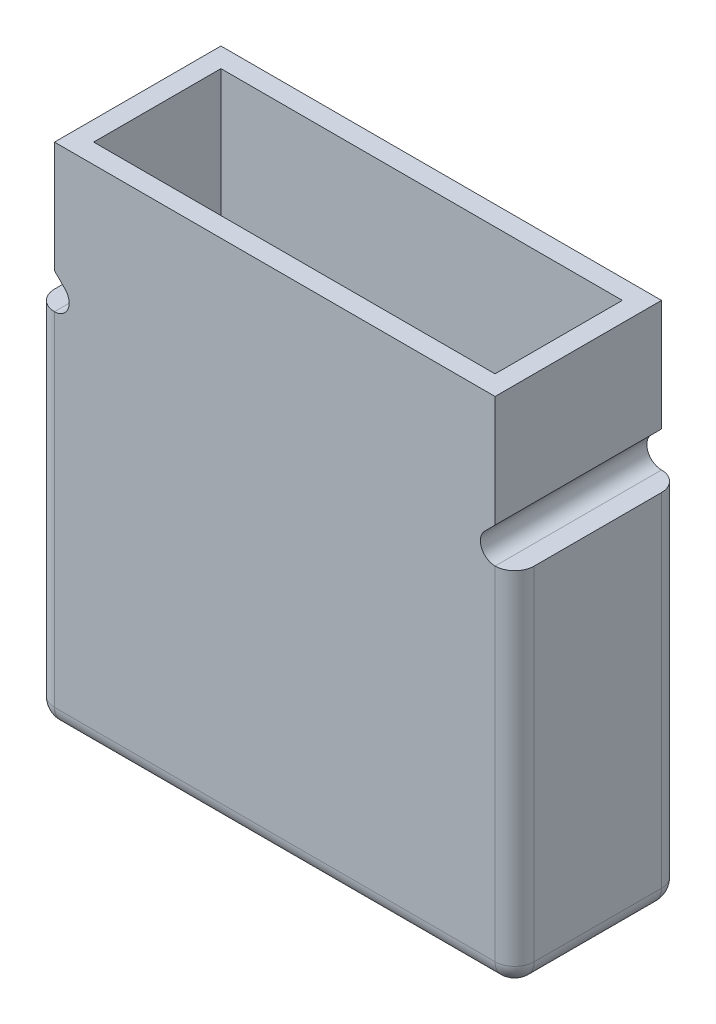
ISO-10303-21;
HEADER;
FILE_DESCRIPTION(('STEP AP214'),'2;1');
FILE_NAME('part.step','',(''),(''),'','','');
FILE_SCHEMA(('AUTOMOTIVE_DESIGN { 1 0 10303 214 1 1 1 1 }'));
ENDSEC;
DATA;
#1=APPLICATION_CONTEXT('core data for automotive mechanical design processes');
#2=APPLICATION_PROTOCOL_DEFINITION('international standard','automotive_design',2000,#1);
#3=PRODUCT_CONTEXT('',#1,'mechanical');
#4=PRODUCT('Part','Part','',(#3));
#5=PRODUCT_RELATED_PRODUCT_CATEGORY('part','',(#4));
#6=PRODUCT_DEFINITION_FORMATION('','',#4);
#7=PRODUCT_DEFINITION_CONTEXT('part definition',#1,'design');
#8=PRODUCT_DEFINITION('design','',#6,#7);
#9=PRODUCT_DEFINITION_SHAPE('','',#8);
#10=(LENGTH_UNIT() NAMED_UNIT(*) SI_UNIT(.MILLI.,.METRE.));
#11=(NAMED_UNIT(*) PLANE_ANGLE_UNIT() SI_UNIT($,.RADIAN.));
#12=(NAMED_UNIT(*) SI_UNIT($,.STERADIAN.) SOLID_ANGLE_UNIT());
#13=UNCERTAINTY_MEASURE_WITH_UNIT(LENGTH_MEASURE(1.E-05),#10,'distance_accuracy_value','');
#14=(GEOMETRIC_REPRESENTATION_CONTEXT(3) GLOBAL_UNCERTAINTY_ASSIGNED_CONTEXT((#13)) GLOBAL_UNIT_ASSIGNED_CONTEXT((#10,
#11,#12)) REPRESENTATION_CONTEXT('',''));
#15=CARTESIAN_POINT('',(0.,0.,0.));
#16=DIRECTION('',(0.,0.,1.));
#17=DIRECTION('',(1.,0.,0.));
#18=AXIS2_PLACEMENT_3D('',#15,#16,#17);
#19=CARTESIAN_POINT('',(-24.5,50.,8.5));
#20=DIRECTION('',(0.,1.,0.));
#21=DIRECTION('',(0.,0.,1.));
#22=AXIS2_PLACEMENT_3D('',#19,#20,#21);
#23=PLANE('',#22);
#24=DIRECTION('',(0.,0.,1.));
#25=VECTOR('',#24,1.);
#26=CARTESIAN_POINT('',(22.5,50.,-12.5));
#27=LINE('',#26,#25);
#28=CARTESIAN_POINT('',(22.5,50.,-8.5));
#29=VERTEX_POINT('',#28);
#30=CARTESIAN_POINT('',(22.5,50.,8.5));
#31=VERTEX_POINT('',#30);
#32=EDGE_CURVE('E674',#29,#31,#27,.T.);
#33=ORIENTED_EDGE('',*,*,#32,.F.);
#34=DIRECTION('',(-1.,0.,0.));
#35=VECTOR('',#34,1.);
#36=CARTESIAN_POINT('',(-24.5,50.,-8.5));
#37=LINE('',#36,#35);
#38=CARTESIAN_POINT('',(-22.5,50.,-8.5));
#39=VERTEX_POINT('',#38);
#40=EDGE_CURVE('E546',#29,#39,#37,.T.);
#41=ORIENTED_EDGE('',*,*,#40,.T.);
#42=DIRECTION('',(0.,0.,1.));
#43=VECTOR('',#42,1.);
#44=CARTESIAN_POINT('',(-22.5,50.,-12.5));
#45=LINE('',#44,#43);
#46=CARTESIAN_POINT('',(-22.5,50.,8.5));
#47=VERTEX_POINT('',#46);
#48=EDGE_CURVE('E522',#39,#47,#45,.T.);
#49=ORIENTED_EDGE('',*,*,#48,.T.);
#50=DIRECTION('',(1.,0.,0.));
#51=VECTOR('',#50,1.);
#52=CARTESIAN_POINT('',(-24.5,50.,8.5));
#53=LINE('',#52,#51);
#54=EDGE_CURVE('E543',#47,#31,#53,.T.);
#55=ORIENTED_EDGE('',*,*,#54,.T.);
#56=EDGE_LOOP('',(#33,#41,#49,#55));
#57=FACE_BOUND('',#56,.T.);
#58=DIRECTION('',(1.,0.,0.));
#59=VECTOR('',#58,1.);
#60=CARTESIAN_POINT('',(-20.5,50.,6.5));
#61=LINE('',#60,#59);
#62=CARTESIAN_POINT('',(-20.5,50.,6.5));
#63=VERTEX_POINT('',#62);
#64=CARTESIAN_POINT('',(20.5,50.,6.5));
#65=VERTEX_POINT('',#64);
#66=EDGE_CURVE('E529',#63,#65,#61,.T.);
#67=ORIENTED_EDGE('',*,*,#66,.F.);
#68=DIRECTION('',(0.,0.,1.));
#69=VECTOR('',#68,1.);
#70=CARTESIAN_POINT('',(-20.5,50.,-6.5));
#71=LINE('',#70,#69);
#72=CARTESIAN_POINT('',(-20.5,50.,-6.5));
#73=VERTEX_POINT('',#72);
#74=EDGE_CURVE('E527',#73,#63,#71,.T.);
#75=ORIENTED_EDGE('',*,*,#74,.F.);
#76=DIRECTION('',(-1.,0.,0.));
#77=VECTOR('',#76,1.);
#78=CARTESIAN_POINT('',(-20.5,50.,-6.5));
#79=LINE('',#78,#77);
#80=CARTESIAN_POINT('',(20.5,50.,-6.5));
#81=VERTEX_POINT('',#80);
#82=EDGE_CURVE('E508',#81,#73,#79,.T.);
#83=ORIENTED_EDGE('',*,*,#82,.F.);
#84=DIRECTION('',(0.,0.,-1.));
#85=VECTOR('',#84,1.);
#86=CARTESIAN_POINT('',(20.5,50.,-6.5));
#87=LINE('',#86,#85);
#88=EDGE_CURVE('E535',#65,#81,#87,.T.);
#89=ORIENTED_EDGE('',*,*,#88,.F.);
#90=EDGE_LOOP('',(#67,#75,#83,#89));
#91=FACE_BOUND('',#90,.T.);
#92=ADVANCED_FACE('F366',(#57,#91),#23,.T.);
#93=CARTESIAN_POINT('',(-24.5,50.,-8.5));
#94=DIRECTION('',(1.,0.,0.));
#95=DIRECTION('',(0.,0.,-1.));
#96=AXIS2_PLACEMENT_3D('',#93,#94,#95);
#97=PLANE('',#96);
#98=DIRECTION('',(0.,0.,1.));
#99=VECTOR('',#98,1.);
#100=CARTESIAN_POINT('',(-24.5,35.,-12.5));
#101=LINE('',#100,#99);
#102=CARTESIAN_POINT('',(-24.5,35.,-6.5));
#103=VERTEX_POINT('',#102);
#104=CARTESIAN_POINT('',(-24.5,35.,6.5));
#105=VERTEX_POINT('',#104);
#106=EDGE_CURVE('E694',#103,#105,#101,.T.);
#107=ORIENTED_EDGE('',*,*,#106,.F.);
#108=DIRECTION('',(0.,-1.,0.));
#109=VECTOR('',#108,1.);
#110=CARTESIAN_POINT('',(-24.5,50.,-6.5));
#111=LINE('',#110,#109);
#112=CARTESIAN_POINT('',(-24.5,0.,-6.5));
#113=VERTEX_POINT('',#112);
#114=EDGE_CURVE('E587',#103,#113,#111,.T.);
#115=ORIENTED_EDGE('',*,*,#114,.T.);
#116=DIRECTION('',(0.,0.,-1.));
#117=VECTOR('',#116,1.);
#118=CARTESIAN_POINT('',(-24.5,0.,8.5));
#119=LINE('',#118,#117);
#120=CARTESIAN_POINT('',(-24.5,0.,6.5));
#121=VERTEX_POINT('',#120);
#122=EDGE_CURVE('E585',#113,#121,#119,.F.);
#123=ORIENTED_EDGE('',*,*,#122,.T.);
#124=DIRECTION('',(0.,-1.,0.));
#125=VECTOR('',#124,1.);
#126=CARTESIAN_POINT('',(-24.5,50.,6.5));
#127=LINE('',#126,#125);
#128=EDGE_CURVE('E583',#121,#105,#127,.F.);
#129=ORIENTED_EDGE('',*,*,#128,.T.);
#130=EDGE_LOOP('',(#107,#115,#123,#129));
#131=FACE_BOUND('',#130,.T.);
#132=ADVANCED_FACE('F368',(#131),#97,.F.);
#133=CARTESIAN_POINT('',(-24.5,50.,8.5));
#134=DIRECTION('',(0.,0.,-1.));
#135=DIRECTION('',(-1.,0.,0.));
#136=AXIS2_PLACEMENT_3D('',#133,#134,#135);
#137=PLANE('',#136);
#138=DIRECTION('',(-1.,0.,0.));
#139=VECTOR('',#138,1.);
#140=CARTESIAN_POINT('',(24.5,0.,8.5));
#141=LINE('',#140,#139);
#142=CARTESIAN_POINT('',(-22.5,0.,8.5));
#143=VERTEX_POINT('',#142);
#144=CARTESIAN_POINT('',(22.5,0.,8.5));
#145=VERTEX_POINT('',#144);
#146=EDGE_CURVE('E595',#143,#145,#141,.F.);
#147=ORIENTED_EDGE('',*,*,#146,.T.);
#148=DIRECTION('',(0.,-1.,0.));
#149=VECTOR('',#148,1.);
#150=CARTESIAN_POINT('',(22.5,50.,8.5));
#151=LINE('',#150,#149);
#152=CARTESIAN_POINT('',(22.5,35.,8.5));
#153=VERTEX_POINT('',#152);
#154=EDGE_CURVE('E597',#145,#153,#151,.F.);
#155=ORIENTED_EDGE('',*,*,#154,.T.);
#156=CARTESIAN_POINT('',(22.5,36.5,8.5));
#157=DIRECTION('',(0.,0.,1.));
#158=DIRECTION('',(-1.,0.,0.));
#159=AXIS2_PLACEMENT_3D('',#156,#157,#158);
#160=CIRCLE('',#159,1.49999999999999);
#161=CARTESIAN_POINT('',(21.4393398282202,37.5606601717798,8.5));
#162=VERTEX_POINT('',#161);
#163=EDGE_CURVE('E671',#162,#153,#160,.T.);
#164=ORIENTED_EDGE('',*,*,#163,.F.);
#165=DIRECTION('',(-0.70710678118654,-0.707106781186554,0.));
#166=VECTOR('',#165,1.);
#167=CARTESIAN_POINT('',(21.4393398282202,37.5606601717798,8.5));
#168=LINE('',#167,#166);
#169=CARTESIAN_POINT('',(22.5,38.6213203435597,8.5));
#170=VERTEX_POINT('',#169);
#171=EDGE_CURVE('E668',#170,#162,#168,.T.);
#172=ORIENTED_EDGE('',*,*,#171,.F.);
#173=DIRECTION('',(0.,-1.,0.));
#174=VECTOR('',#173,1.);
#175=CARTESIAN_POINT('',(22.5,50.,8.5));
#176=LINE('',#175,#174);
#177=EDGE_CURVE('E665',#31,#170,#176,.T.);
#178=ORIENTED_EDGE('',*,*,#177,.F.);
#179=ORIENTED_EDGE('',*,*,#54,.F.);
#180=DIRECTION('',(0.,1.,0.));
#181=VECTOR('',#180,1.);
#182=CARTESIAN_POINT('',(-22.5,38.6213203435597,8.5));
#183=LINE('',#182,#181);
#184=CARTESIAN_POINT('',(-22.5,38.6213203435597,8.5));
#185=VERTEX_POINT('',#184);
#186=EDGE_CURVE('E692',#185,#47,#183,.T.);
#187=ORIENTED_EDGE('',*,*,#186,.F.);
#188=DIRECTION('',(-0.707106781186547,0.707106781186547,0.));
#189=VECTOR('',#188,1.);
#190=CARTESIAN_POINT('',(-21.4393398282202,37.5606601717798,8.5));
#191=LINE('',#190,#189);
#192=CARTESIAN_POINT('',(-21.4393398282202,37.5606601717798,8.5));
#193=VERTEX_POINT('',#192);
#194=EDGE_CURVE('E689',#193,#185,#191,.T.);
#195=ORIENTED_EDGE('',*,*,#194,.F.);
#196=CARTESIAN_POINT('',(-22.5,36.5,8.5));
#197=DIRECTION('',(0.,0.,1.));
#198=DIRECTION('',(1.,0.,0.));
#199=AXIS2_PLACEMENT_3D('',#196,#197,#198);
#200=CIRCLE('',#199,1.5);
#201=CARTESIAN_POINT('',(-22.5,35.,8.5));
#202=VERTEX_POINT('',#201);
#203=EDGE_CURVE('E678',#202,#193,#200,.T.);
#204=ORIENTED_EDGE('',*,*,#203,.F.);
#205=DIRECTION('',(0.,-1.,0.));
#206=VECTOR('',#205,1.);
#207=CARTESIAN_POINT('',(-22.5,50.,8.5));
#208=LINE('',#207,#206);
#209=EDGE_CURVE('E593',#202,#143,#208,.T.);
#210=ORIENTED_EDGE('',*,*,#209,.T.);
#211=EDGE_LOOP('',(#147,#155,#164,#172,#178,#179,#187,#195,#204,#210));
#212=FACE_BOUND('',#211,.T.);
#213=ADVANCED_FACE('F720',(#212),#137,.F.);
#214=CARTESIAN_POINT('',(24.5,50.,-8.5));
#215=DIRECTION('',(-1.,0.,0.));
#216=DIRECTION('',(0.,0.,1.));
#217=AXIS2_PLACEMENT_3D('',#214,#215,#216);
#218=PLANE('',#217);
#219=DIRECTION('',(0.,0.,1.));
#220=VECTOR('',#219,1.);
#221=CARTESIAN_POINT('',(24.5,0.,-8.5));
#222=LINE('',#221,#220);
#223=CARTESIAN_POINT('',(24.5,0.,6.5));
#224=VERTEX_POINT('',#223);
#225=CARTESIAN_POINT('',(24.5,0.,-6.5));
#226=VERTEX_POINT('',#225);
#227=EDGE_CURVE('E573',#224,#226,#222,.F.);
#228=ORIENTED_EDGE('',*,*,#227,.T.);
#229=DIRECTION('',(0.,-1.,0.));
#230=VECTOR('',#229,1.);
#231=CARTESIAN_POINT('',(24.5,50.,-6.5));
#232=LINE('',#231,#230);
#233=CARTESIAN_POINT('',(24.5,35.,-6.5));
#234=VERTEX_POINT('',#233);
#235=EDGE_CURVE('E577',#226,#234,#232,.F.);
#236=ORIENTED_EDGE('',*,*,#235,.T.);
#237=DIRECTION('',(0.,0.,1.));
#238=VECTOR('',#237,1.);
#239=CARTESIAN_POINT('',(24.5,35.,-12.5));
#240=LINE('',#239,#238);
#241=CARTESIAN_POINT('',(24.5,35.,6.5));
#242=VERTEX_POINT('',#241);
#243=EDGE_CURVE('E675',#234,#242,#240,.T.);
#244=ORIENTED_EDGE('',*,*,#243,.T.);
#245=DIRECTION('',(0.,-1.,0.));
#246=VECTOR('',#245,1.);
#247=CARTESIAN_POINT('',(24.5,50.,6.5));
#248=LINE('',#247,#246);
#249=EDGE_CURVE('E575',#242,#224,#248,.T.);
#250=ORIENTED_EDGE('',*,*,#249,.T.);
#251=EDGE_LOOP('',(#228,#236,#244,#250));
#252=FACE_BOUND('',#251,.T.);
#253=ADVANCED_FACE('F729',(#252),#218,.F.);
#254=CARTESIAN_POINT('',(-24.5,50.,-8.5));
#255=DIRECTION('',(0.,0.,1.));
#256=DIRECTION('',(1.,0.,0.));
#257=AXIS2_PLACEMENT_3D('',#254,#255,#256);
#258=PLANE('',#257);
#259=CARTESIAN_POINT('',(22.5,36.5,-8.5));
#260=DIRECTION('',(0.,0.,1.));
#261=DIRECTION('',(1.,0.,0.));
#262=AXIS2_PLACEMENT_3D('',#259,#260,#261);
#263=CIRCLE('',#262,1.49999999999999);
#264=CARTESIAN_POINT('',(21.4393398282202,37.5606601717798,-8.5));
#265=VERTEX_POINT('',#264);
#266=CARTESIAN_POINT('',(22.5,35.,-8.5));
#267=VERTEX_POINT('',#266);
#268=EDGE_CURVE('E563',#265,#267,#263,.T.);
#269=ORIENTED_EDGE('',*,*,#268,.T.);
#270=DIRECTION('',(0.,-1.,0.));
#271=VECTOR('',#270,1.);
#272=CARTESIAN_POINT('',(22.5,50.,-8.5));
#273=LINE('',#272,#271);
#274=CARTESIAN_POINT('',(22.5,0.,-8.5));
#275=VERTEX_POINT('',#274);
#276=EDGE_CURVE('E570',#267,#275,#273,.T.);
#277=ORIENTED_EDGE('',*,*,#276,.T.);
#278=DIRECTION('',(1.,0.,0.));
#279=VECTOR('',#278,1.);
#280=CARTESIAN_POINT('',(-24.5,0.,-8.5));
#281=LINE('',#280,#279);
#282=CARTESIAN_POINT('',(-22.5,0.,-8.5));
#283=VERTEX_POINT('',#282);
#284=EDGE_CURVE('E566',#275,#283,#281,.F.);
#285=ORIENTED_EDGE('',*,*,#284,.T.);
#286=DIRECTION('',(0.,-1.,0.));
#287=VECTOR('',#286,1.);
#288=CARTESIAN_POINT('',(-22.5,50.,-8.5));
#289=LINE('',#288,#287);
#290=CARTESIAN_POINT('',(-22.5,35.,-8.5));
#291=VERTEX_POINT('',#290);
#292=EDGE_CURVE('E568',#283,#291,#289,.F.);
#293=ORIENTED_EDGE('',*,*,#292,.T.);
#294=CARTESIAN_POINT('',(-22.5,36.5,-8.5));
#295=DIRECTION('',(0.,0.,1.));
#296=DIRECTION('',(1.,0.,0.));
#297=AXIS2_PLACEMENT_3D('',#294,#295,#296);
#298=CIRCLE('',#297,1.5);
#299=CARTESIAN_POINT('',(-21.4393398282202,37.5606601717798,-8.5));
#300=VERTEX_POINT('',#299);
#301=EDGE_CURVE('E548',#291,#300,#298,.T.);
#302=ORIENTED_EDGE('',*,*,#301,.T.);
#303=DIRECTION('',(-0.707106781186548,0.707106781186548,0.));
#304=VECTOR('',#303,1.);
#305=CARTESIAN_POINT('',(-29.1893398282202,45.3106601717798,-8.5));
#306=LINE('',#305,#304);
#307=CARTESIAN_POINT('',(-22.5,38.6213203435597,-8.5));
#308=VERTEX_POINT('',#307);
#309=EDGE_CURVE('E551',#300,#308,#306,.T.);
#310=ORIENTED_EDGE('',*,*,#309,.T.);
#311=DIRECTION('',(0.,1.,0.));
#312=VECTOR('',#311,1.);
#313=CARTESIAN_POINT('',(-22.5,50.,-8.5));
#314=LINE('',#313,#312);
#315=EDGE_CURVE('E554',#308,#39,#314,.T.);
#316=ORIENTED_EDGE('',*,*,#315,.T.);
#317=ORIENTED_EDGE('',*,*,#40,.F.);
#318=DIRECTION('',(0.,-1.,0.));
#319=VECTOR('',#318,1.);
#320=CARTESIAN_POINT('',(22.5,50.,-8.5));
#321=LINE('',#320,#319);
#322=CARTESIAN_POINT('',(22.5,38.6213203435597,-8.5));
#323=VERTEX_POINT('',#322);
#324=EDGE_CURVE('E557',#29,#323,#321,.T.);
#325=ORIENTED_EDGE('',*,*,#324,.T.);
#326=DIRECTION('',(-0.707106781186541,-0.707106781186554,0.));
#327=VECTOR('',#326,1.);
#328=CARTESIAN_POINT('',(4.68933982822064,20.8106601717799,-8.5));
#329=LINE('',#328,#327);
#330=EDGE_CURVE('E560',#323,#265,#329,.T.);
#331=ORIENTED_EDGE('',*,*,#330,.T.);
#332=EDGE_LOOP('',(#269,#277,#285,#293,#302,#310,#316,#317,#325,#331));
#333=FACE_BOUND('',#332,.T.);
#334=ADVANCED_FACE('F726',(#333),#258,.F.);
#335=CARTESIAN_POINT('',(-20.5,50.,-6.5));
#336=DIRECTION('',(1.,0.,0.));
#337=DIRECTION('',(0.,0.,-1.));
#338=AXIS2_PLACEMENT_3D('',#335,#336,#337);
#339=PLANE('',#338);
#340=DIRECTION('',(0.,0.,1.));
#341=VECTOR('',#340,1.);
#342=CARTESIAN_POINT('',(-20.5,0.,-6.5));
#343=LINE('',#342,#341);
#344=CARTESIAN_POINT('',(-20.5,0.,-6.5));
#345=VERTEX_POINT('',#344);
#346=CARTESIAN_POINT('',(-20.5,0.,6.5));
#347=VERTEX_POINT('',#346);
#348=EDGE_CURVE('E515',#345,#347,#343,.T.);
#349=ORIENTED_EDGE('',*,*,#348,.F.);
#350=DIRECTION('',(0.,-1.,0.));
#351=VECTOR('',#350,1.);
#352=CARTESIAN_POINT('',(-20.5,50.,-6.5));
#353=LINE('',#352,#351);
#354=EDGE_CURVE('E501',#73,#345,#353,.T.);
#355=ORIENTED_EDGE('',*,*,#354,.F.);
#356=ORIENTED_EDGE('',*,*,#74,.T.);
#357=DIRECTION('',(0.,-1.,0.));
#358=VECTOR('',#357,1.);
#359=CARTESIAN_POINT('',(-20.5,50.,6.5));
#360=LINE('',#359,#358);
#361=EDGE_CURVE('E518',#63,#347,#360,.T.);
#362=ORIENTED_EDGE('',*,*,#361,.T.);
#363=EDGE_LOOP('',(#349,#355,#356,#362));
#364=FACE_BOUND('',#363,.T.);
#365=ADVANCED_FACE('F516',(#364),#339,.T.);
#366=CARTESIAN_POINT('',(-20.5,50.,6.5));
#367=DIRECTION('',(0.,0.,-1.));
#368=DIRECTION('',(-1.,0.,0.));
#369=AXIS2_PLACEMENT_3D('',#366,#367,#368);
#370=PLANE('',#369);
#371=DIRECTION('',(1.,0.,0.));
#372=VECTOR('',#371,1.);
#373=CARTESIAN_POINT('',(-20.5,0.,6.5));
#374=LINE('',#373,#372);
#375=CARTESIAN_POINT('',(20.5,0.,6.5));
#376=VERTEX_POINT('',#375);
#377=EDGE_CURVE('E521',#347,#376,#374,.T.);
#378=ORIENTED_EDGE('',*,*,#377,.F.);
#379=ORIENTED_EDGE('',*,*,#361,.F.);
#380=ORIENTED_EDGE('',*,*,#66,.T.);
#381=DIRECTION('',(0.,-1.,0.));
#382=VECTOR('',#381,1.);
#383=CARTESIAN_POINT('',(20.5,50.,6.5));
#384=LINE('',#383,#382);
#385=EDGE_CURVE('E540',#65,#376,#384,.T.);
#386=ORIENTED_EDGE('',*,*,#385,.T.);
#387=EDGE_LOOP('',(#378,#379,#380,#386));
#388=FACE_BOUND('',#387,.T.);
#389=ADVANCED_FACE('F706',(#388),#370,.T.);
#390=CARTESIAN_POINT('',(20.5,50.,-6.5));
#391=DIRECTION('',(-1.,0.,0.));
#392=DIRECTION('',(0.,0.,1.));
#393=AXIS2_PLACEMENT_3D('',#390,#391,#392);
#394=PLANE('',#393);
#395=DIRECTION('',(0.,0.,-1.));
#396=VECTOR('',#395,1.);
#397=CARTESIAN_POINT('',(20.5,0.,-6.5));
#398=LINE('',#397,#396);
#399=CARTESIAN_POINT('',(20.5,0.,-6.5));
#400=VERTEX_POINT('',#399);
#401=EDGE_CURVE('E526',#376,#400,#398,.T.);
#402=ORIENTED_EDGE('',*,*,#401,.F.);
#403=ORIENTED_EDGE('',*,*,#385,.F.);
#404=ORIENTED_EDGE('',*,*,#88,.T.);
#405=DIRECTION('',(0.,-1.,0.));
#406=VECTOR('',#405,1.);
#407=CARTESIAN_POINT('',(20.5,50.,-6.5));
#408=LINE('',#407,#406);
#409=EDGE_CURVE('E511',#81,#400,#408,.T.);
#410=ORIENTED_EDGE('',*,*,#409,.T.);
#411=EDGE_LOOP('',(#402,#403,#404,#410));
#412=FACE_BOUND('',#411,.T.);
#413=ADVANCED_FACE('F711',(#412),#394,.T.);
#414=CARTESIAN_POINT('',(-20.5,50.,-6.5));
#415=DIRECTION('',(0.,0.,1.));
#416=DIRECTION('',(1.,0.,0.));
#417=AXIS2_PLACEMENT_3D('',#414,#415,#416);
#418=PLANE('',#417);
#419=DIRECTION('',(-1.,0.,0.));
#420=VECTOR('',#419,1.);
#421=CARTESIAN_POINT('',(-20.5,0.,-6.5));
#422=LINE('',#421,#420);
#423=EDGE_CURVE('E505',#400,#345,#422,.T.);
#424=ORIENTED_EDGE('',*,*,#423,.F.);
#425=ORIENTED_EDGE('',*,*,#409,.F.);
#426=ORIENTED_EDGE('',*,*,#82,.T.);
#427=ORIENTED_EDGE('',*,*,#354,.T.);
#428=EDGE_LOOP('',(#424,#425,#426,#427));
#429=FACE_BOUND('',#428,.T.);
#430=ADVANCED_FACE('F503',(#429),#418,.T.);
#431=CARTESIAN_POINT('',(-22.5,38.6213203435597,-12.5));
#432=DIRECTION('',(1.,0.,0.));
#433=DIRECTION('',(0.,0.,-1.));
#434=AXIS2_PLACEMENT_3D('',#431,#432,#433);
#435=PLANE('',#434);
#436=DIRECTION('',(0.,0.,1.));
#437=VECTOR('',#436,1.);
#438=CARTESIAN_POINT('',(-22.5,38.6213203435597,-12.5));
#439=LINE('',#438,#437);
#440=EDGE_CURVE('E697',#308,#185,#439,.T.);
#441=ORIENTED_EDGE('',*,*,#440,.T.);
#442=ORIENTED_EDGE('',*,*,#186,.T.);
#443=ORIENTED_EDGE('',*,*,#48,.F.);
#444=ORIENTED_EDGE('',*,*,#315,.F.);
#445=EDGE_LOOP('',(#441,#442,#443,#444));
#446=FACE_BOUND('',#445,.T.);
#447=ADVANCED_FACE('F773',(#446),#435,.F.);
#448=CARTESIAN_POINT('',(-21.4393398282202,37.5606601717798,-12.5));
#449=DIRECTION('',(0.707106781186547,0.707106781186547,0.));
#450=DIRECTION('',(-0.707106781186548,0.707106781186548,0.));
#451=AXIS2_PLACEMENT_3D('',#448,#449,#450);
#452=PLANE('',#451);
#453=DIRECTION('',(0.,0.,1.));
#454=VECTOR('',#453,1.);
#455=CARTESIAN_POINT('',(-21.4393398282202,37.5606601717798,-12.5));
#456=LINE('',#455,#454);
#457=EDGE_CURVE('E699',#300,#193,#456,.T.);
#458=ORIENTED_EDGE('',*,*,#457,.T.);
#459=ORIENTED_EDGE('',*,*,#194,.T.);
#460=ORIENTED_EDGE('',*,*,#440,.F.);
#461=ORIENTED_EDGE('',*,*,#309,.F.);
#462=EDGE_LOOP('',(#458,#459,#460,#461));
#463=FACE_BOUND('',#462,.T.);
#464=ADVANCED_FACE('F778',(#463),#452,.F.);
#465=CARTESIAN_POINT('',(-22.5,36.5,-12.5));
#466=DIRECTION('',(0.,0.,1.));
#467=DIRECTION('',(1.,0.,0.));
#468=AXIS2_PLACEMENT_3D('',#465,#466,#467);
#469=CYLINDRICAL_SURFACE('',#468,1.5);
#470=DIRECTION('',(0.,0.,1.));
#471=VECTOR('',#470,1.);
#472=CARTESIAN_POINT('',(-22.5,35.,-12.5));
#473=LINE('',#472,#471);
#474=EDGE_CURVE('E701',#291,#202,#473,.T.);
#475=ORIENTED_EDGE('',*,*,#474,.T.);
#476=ORIENTED_EDGE('',*,*,#203,.T.);
#477=ORIENTED_EDGE('',*,*,#457,.F.);
#478=ORIENTED_EDGE('',*,*,#301,.F.);
#479=EDGE_LOOP('',(#475,#476,#477,#478));
#480=FACE_BOUND('',#479,.T.);
#481=ADVANCED_FACE('F780',(#480),#469,.F.);
#482=CARTESIAN_POINT('',(-24.5,35.,-12.5));
#483=DIRECTION('',(0.,-1.,0.));
#484=DIRECTION('',(1.,0.,0.));
#485=AXIS2_PLACEMENT_3D('',#482,#483,#484);
#486=PLANE('',#485);
#487=ORIENTED_EDGE('',*,*,#474,.F.);
#488=CARTESIAN_POINT('',(-22.5,35.,-6.5));
#489=DIRECTION('',(0.,-1.,0.));
#490=DIRECTION('',(1.,0.,0.));
#491=AXIS2_PLACEMENT_3D('',#488,#489,#490);
#492=CIRCLE('',#491,2.);
#493=EDGE_CURVE('E591',#291,#103,#492,.F.);
#494=ORIENTED_EDGE('',*,*,#493,.T.);
#495=ORIENTED_EDGE('',*,*,#106,.T.);
#496=CARTESIAN_POINT('',(-22.5,35.,6.5));
#497=DIRECTION('',(0.,-1.,0.));
#498=DIRECTION('',(1.,0.,0.));
#499=AXIS2_PLACEMENT_3D('',#496,#497,#498);
#500=CIRCLE('',#499,2.);
#501=EDGE_CURVE('E589',#105,#202,#500,.F.);
#502=ORIENTED_EDGE('',*,*,#501,.T.);
#503=EDGE_LOOP('',(#487,#494,#495,#502));
#504=FACE_BOUND('',#503,.T.);
#505=ADVANCED_FACE('F791',(#504),#486,.F.);
#506=CARTESIAN_POINT('',(24.5,35.,-12.5));
#507=DIRECTION('',(0.,-1.,0.));
#508=DIRECTION('',(1.,0.,0.));
#509=AXIS2_PLACEMENT_3D('',#506,#507,#508);
#510=PLANE('',#509);
#511=ORIENTED_EDGE('',*,*,#243,.F.);
#512=CARTESIAN_POINT('',(22.5,35.,-6.5));
#513=DIRECTION('',(0.,-1.,0.));
#514=DIRECTION('',(1.,0.,0.));
#515=AXIS2_PLACEMENT_3D('',#512,#513,#514);
#516=CIRCLE('',#515,2.);
#517=EDGE_CURVE('E581',#234,#267,#516,.F.);
#518=ORIENTED_EDGE('',*,*,#517,.T.);
#519=DIRECTION('',(0.,0.,1.));
#520=VECTOR('',#519,1.);
#521=CARTESIAN_POINT('',(22.5,35.,-12.5));
#522=LINE('',#521,#520);
#523=EDGE_CURVE('E679',#267,#153,#522,.T.);
#524=ORIENTED_EDGE('',*,*,#523,.T.);
#525=CARTESIAN_POINT('',(22.5,35.,6.5));
#526=DIRECTION('',(0.,-1.,0.));
#527=DIRECTION('',(1.,0.,0.));
#528=AXIS2_PLACEMENT_3D('',#525,#526,#527);
#529=CIRCLE('',#528,2.);
#530=EDGE_CURVE('E579',#153,#242,#529,.F.);
#531=ORIENTED_EDGE('',*,*,#530,.T.);
#532=EDGE_LOOP('',(#511,#518,#524,#531));
#533=FACE_BOUND('',#532,.T.);
#534=ADVANCED_FACE('F753',(#533),#510,.F.);
#535=CARTESIAN_POINT('',(22.5,36.5,-12.5));
#536=DIRECTION('',(0.,0.,1.));
#537=DIRECTION('',(1.,0.,0.));
#538=AXIS2_PLACEMENT_3D('',#535,#536,#537);
#539=CYLINDRICAL_SURFACE('',#538,1.49999999999999);
#540=DIRECTION('',(0.,0.,1.));
#541=VECTOR('',#540,1.);
#542=CARTESIAN_POINT('',(21.4393398282202,37.5606601717798,-12.5));
#543=LINE('',#542,#541);
#544=EDGE_CURVE('E682',#265,#162,#543,.T.);
#545=ORIENTED_EDGE('',*,*,#544,.T.);
#546=ORIENTED_EDGE('',*,*,#163,.T.);
#547=ORIENTED_EDGE('',*,*,#523,.F.);
#548=ORIENTED_EDGE('',*,*,#268,.F.);
#549=EDGE_LOOP('',(#545,#546,#547,#548));
#550=FACE_BOUND('',#549,.T.);
#551=ADVANCED_FACE('F762',(#550),#539,.F.);
#552=CARTESIAN_POINT('',(21.4393398282202,37.5606601717798,-12.5));
#553=DIRECTION('',(-0.707106781186554,0.707106781186541,0.));
#554=DIRECTION('',(-0.707106781186541,-0.707106781186554,0.));
#555=AXIS2_PLACEMENT_3D('',#552,#553,#554);
#556=PLANE('',#555);
#557=DIRECTION('',(0.,0.,1.));
#558=VECTOR('',#557,1.);
#559=CARTESIAN_POINT('',(22.5,38.6213203435597,-12.5));
#560=LINE('',#559,#558);
#561=EDGE_CURVE('E684',#323,#170,#560,.T.);
#562=ORIENTED_EDGE('',*,*,#561,.T.);
#563=ORIENTED_EDGE('',*,*,#171,.T.);
#564=ORIENTED_EDGE('',*,*,#544,.F.);
#565=ORIENTED_EDGE('',*,*,#330,.F.);
#566=EDGE_LOOP('',(#562,#563,#564,#565));
#567=FACE_BOUND('',#566,.T.);
#568=ADVANCED_FACE('F764',(#567),#556,.F.);
#569=CARTESIAN_POINT('',(22.5,50.,-12.5));
#570=DIRECTION('',(-1.,0.,0.));
#571=DIRECTION('',(0.,0.,1.));
#572=AXIS2_PLACEMENT_3D('',#569,#570,#571);
#573=PLANE('',#572);
#574=ORIENTED_EDGE('',*,*,#32,.T.);
#575=ORIENTED_EDGE('',*,*,#177,.T.);
#576=ORIENTED_EDGE('',*,*,#561,.F.);
#577=ORIENTED_EDGE('',*,*,#324,.F.);
#578=EDGE_LOOP('',(#574,#575,#576,#577));
#579=FACE_BOUND('',#578,.T.);
#580=ADVANCED_FACE('F808',(#579),#573,.F.);
#581=CARTESIAN_POINT('',(-24.5,0.,-8.5));
#582=DIRECTION('',(0.,-1.,0.));
#583=DIRECTION('',(0.,0.,-1.));
#584=AXIS2_PLACEMENT_3D('',#581,#582,#583);
#585=PLANE('',#584);
#586=ORIENTED_EDGE('',*,*,#348,.T.);
#587=ORIENTED_EDGE('',*,*,#377,.T.);
#588=ORIENTED_EDGE('',*,*,#401,.T.);
#589=ORIENTED_EDGE('',*,*,#423,.T.);
#590=EDGE_LOOP('',(#586,#587,#588,#589));
#591=FACE_BOUND('',#590,.T.);
#592=ADVANCED_FACE('F524',(#591),#585,.F.);
#593=CARTESIAN_POINT('',(-24.5,-2.,-8.5));
#594=DIRECTION('',(0.,-1.,0.));
#595=DIRECTION('',(0.,0.,-1.));
#596=AXIS2_PLACEMENT_3D('',#593,#594,#595);
#597=PLANE('',#596);
#598=DIRECTION('',(1.,0.,0.));
#599=VECTOR('',#598,1.);
#600=CARTESIAN_POINT('',(24.5,-2.,-6.5));
#601=LINE('',#600,#599);
#602=CARTESIAN_POINT('',(-22.5,-2.,-6.5));
#603=VERTEX_POINT('',#602);
#604=CARTESIAN_POINT('',(22.5,-2.,-6.5));
#605=VERTEX_POINT('',#604);
#606=EDGE_CURVE('E374',#603,#605,#601,.T.);
#607=ORIENTED_EDGE('',*,*,#606,.T.);
#608=DIRECTION('',(0.,0.,1.));
#609=VECTOR('',#608,1.);
#610=CARTESIAN_POINT('',(22.5,-2.,8.5));
#611=LINE('',#610,#609);
#612=CARTESIAN_POINT('',(22.5,-2.,6.5));
#613=VERTEX_POINT('',#612);
#614=EDGE_CURVE('E11',#605,#613,#611,.T.);
#615=ORIENTED_EDGE('',*,*,#614,.T.);
#616=DIRECTION('',(-1.,0.,0.));
#617=VECTOR('',#616,1.);
#618=CARTESIAN_POINT('',(-24.5,-2.,6.5));
#619=LINE('',#618,#617);
#620=CARTESIAN_POINT('',(-22.5,-2.,6.5));
#621=VERTEX_POINT('',#620);
#622=EDGE_CURVE('E599',#613,#621,#619,.T.);
#623=ORIENTED_EDGE('',*,*,#622,.T.);
#624=DIRECTION('',(0.,0.,-1.));
#625=VECTOR('',#624,1.);
#626=CARTESIAN_POINT('',(-22.5,-2.,-8.5));
#627=LINE('',#626,#625);
#628=EDGE_CURVE('E384',#621,#603,#627,.T.);
#629=ORIENTED_EDGE('',*,*,#628,.T.);
#630=EDGE_LOOP('',(#607,#615,#623,#629));
#631=FACE_BOUND('',#630,.T.);
#632=ADVANCED_FACE('F603',(#631),#597,.T.);
#633=CARTESIAN_POINT('',(-22.5,50.,6.5));
#634=DIRECTION('',(0.,-1.,0.));
#635=DIRECTION('',(0.,0.,-1.));
#636=AXIS2_PLACEMENT_3D('',#633,#634,#635);
#637=CYLINDRICAL_SURFACE('',#636,2.);
#638=CARTESIAN_POINT('',(-22.5,0.,6.5));
#639=DIRECTION('',(0.,-1.,0.));
#640=DIRECTION('',(0.,0.,-1.));
#641=AXIS2_PLACEMENT_3D('',#638,#639,#640);
#642=CIRCLE('',#641,2.);
#643=EDGE_CURVE('E619',#143,#121,#642,.T.);
#644=ORIENTED_EDGE('',*,*,#643,.F.);
#645=ORIENTED_EDGE('',*,*,#209,.F.);
#646=ORIENTED_EDGE('',*,*,#501,.F.);
#647=ORIENTED_EDGE('',*,*,#128,.F.);
#648=EDGE_LOOP('',(#644,#645,#646,#647));
#649=FACE_BOUND('',#648,.T.);
#650=ADVANCED_FACE('F786',(#649),#637,.T.);
#651=CARTESIAN_POINT('',(-22.5,0.,6.5));
#652=DIRECTION('',(0.,0.,1.));
#653=DIRECTION('',(1.,0.,0.));
#654=AXIS2_PLACEMENT_3D('',#651,#652,#653);
#655=SPHERICAL_SURFACE('',#654,2.);
#656=CARTESIAN_POINT('',(-22.5,0.,6.5));
#657=DIRECTION('',(-1.,0.,0.));
#658=DIRECTION('',(0.,0.,1.));
#659=AXIS2_PLACEMENT_3D('',#656,#657,#658);
#660=CIRCLE('',#659,2.);
#661=EDGE_CURVE('E608',#143,#621,#660,.F.);
#662=ORIENTED_EDGE('',*,*,#661,.F.);
#663=ORIENTED_EDGE('',*,*,#643,.T.);
#664=CARTESIAN_POINT('',(-22.5,0.,6.5));
#665=DIRECTION('',(0.,0.,1.));
#666=DIRECTION('',(1.,0.,0.));
#667=AXIS2_PLACEMENT_3D('',#664,#665,#666);
#668=CIRCLE('',#667,2.);
#669=EDGE_CURVE('E613',#621,#121,#668,.F.);
#670=ORIENTED_EDGE('',*,*,#669,.F.);
#671=EDGE_LOOP('',(#662,#663,#670));
#672=FACE_BOUND('',#671,.T.);
#673=ADVANCED_FACE('F617',(#672),#655,.T.);
#674=CARTESIAN_POINT('',(-22.5,50.,-6.5));
#675=DIRECTION('',(0.,-1.,0.));
#676=DIRECTION('',(0.,0.,-1.));
#677=AXIS2_PLACEMENT_3D('',#674,#675,#676);
#678=CYLINDRICAL_SURFACE('',#677,2.);
#679=ORIENTED_EDGE('',*,*,#493,.F.);
#680=ORIENTED_EDGE('',*,*,#292,.F.);
#681=CARTESIAN_POINT('',(-22.5,0.,-6.5));
#682=DIRECTION('',(0.,-1.,0.));
#683=DIRECTION('',(0.,0.,-1.));
#684=AXIS2_PLACEMENT_3D('',#681,#682,#683);
#685=CIRCLE('',#684,2.);
#686=EDGE_CURVE('E614',#113,#283,#685,.T.);
#687=ORIENTED_EDGE('',*,*,#686,.F.);
#688=ORIENTED_EDGE('',*,*,#114,.F.);
#689=EDGE_LOOP('',(#679,#680,#687,#688));
#690=FACE_BOUND('',#689,.T.);
#691=ADVANCED_FACE('F793',(#690),#678,.T.);
#692=CARTESIAN_POINT('',(-22.5,0.,-8.5));
#693=DIRECTION('',(0.,0.,1.));
#694=DIRECTION('',(1.,0.,0.));
#695=AXIS2_PLACEMENT_3D('',#692,#693,#694);
#696=CYLINDRICAL_SURFACE('',#695,2.);
#697=ORIENTED_EDGE('',*,*,#669,.T.);
#698=ORIENTED_EDGE('',*,*,#122,.F.);
#699=CARTESIAN_POINT('',(-22.5,0.,-6.5));
#700=DIRECTION('',(0.,0.,-1.));
#701=DIRECTION('',(-1.,0.,0.));
#702=AXIS2_PLACEMENT_3D('',#699,#700,#701);
#703=CIRCLE('',#702,2.);
#704=EDGE_CURVE('E625',#603,#113,#703,.T.);
#705=ORIENTED_EDGE('',*,*,#704,.F.);
#706=ORIENTED_EDGE('',*,*,#628,.F.);
#707=EDGE_LOOP('',(#697,#698,#705,#706));
#708=FACE_BOUND('',#707,.T.);
#709=ADVANCED_FACE('F623',(#708),#696,.T.);
#710=CARTESIAN_POINT('',(-24.5,0.,6.5));
#711=DIRECTION('',(1.,0.,0.));
#712=DIRECTION('',(0.,0.,-1.));
#713=AXIS2_PLACEMENT_3D('',#710,#711,#712);
#714=CYLINDRICAL_SURFACE('',#713,2.);
#715=ORIENTED_EDGE('',*,*,#661,.T.);
#716=ORIENTED_EDGE('',*,*,#622,.F.);
#717=CARTESIAN_POINT('',(22.5,0.,6.5));
#718=DIRECTION('',(1.,0.,0.));
#719=DIRECTION('',(0.,0.,-1.));
#720=AXIS2_PLACEMENT_3D('',#717,#718,#719);
#721=CIRCLE('',#720,2.);
#722=EDGE_CURVE('E630',#145,#613,#721,.T.);
#723=ORIENTED_EDGE('',*,*,#722,.F.);
#724=ORIENTED_EDGE('',*,*,#146,.F.);
#725=EDGE_LOOP('',(#715,#716,#723,#724));
#726=FACE_BOUND('',#725,.T.);
#727=ADVANCED_FACE('F610',(#726),#714,.T.);
#728=CARTESIAN_POINT('',(22.5,50.,6.5));
#729=DIRECTION('',(0.,-1.,0.));
#730=DIRECTION('',(0.,0.,-1.));
#731=AXIS2_PLACEMENT_3D('',#728,#729,#730);
#732=CYLINDRICAL_SURFACE('',#731,2.);
#733=ORIENTED_EDGE('',*,*,#530,.F.);
#734=ORIENTED_EDGE('',*,*,#154,.F.);
#735=CARTESIAN_POINT('',(22.5,0.,6.5));
#736=DIRECTION('',(0.,-1.,0.));
#737=DIRECTION('',(0.,0.,-1.));
#738=AXIS2_PLACEMENT_3D('',#735,#736,#737);
#739=CIRCLE('',#738,2.);
#740=EDGE_CURVE('E637',#224,#145,#739,.T.);
#741=ORIENTED_EDGE('',*,*,#740,.F.);
#742=ORIENTED_EDGE('',*,*,#249,.F.);
#743=EDGE_LOOP('',(#733,#734,#741,#742));
#744=FACE_BOUND('',#743,.T.);
#745=ADVANCED_FACE('F744',(#744),#732,.T.);
#746=CARTESIAN_POINT('',(-22.5,0.,-6.5));
#747=DIRECTION('',(0.,0.,1.));
#748=DIRECTION('',(1.,0.,0.));
#749=AXIS2_PLACEMENT_3D('',#746,#747,#748);
#750=SPHERICAL_SURFACE('',#749,2.);
#751=ORIENTED_EDGE('',*,*,#704,.T.);
#752=ORIENTED_EDGE('',*,*,#686,.T.);
#753=CARTESIAN_POINT('',(-22.5,0.,-6.5));
#754=DIRECTION('',(-1.,0.,0.));
#755=DIRECTION('',(0.,0.,1.));
#756=AXIS2_PLACEMENT_3D('',#753,#754,#755);
#757=CIRCLE('',#756,2.);
#758=EDGE_CURVE('E633',#603,#283,#757,.F.);
#759=ORIENTED_EDGE('',*,*,#758,.F.);
#760=EDGE_LOOP('',(#751,#752,#759));
#761=FACE_BOUND('',#760,.T.);
#762=ADVANCED_FACE('F634',(#761),#750,.T.);
#763=CARTESIAN_POINT('',(22.5,0.,6.5));
#764=DIRECTION('',(0.,0.,1.));
#765=DIRECTION('',(1.,0.,0.));
#766=AXIS2_PLACEMENT_3D('',#763,#764,#765);
#767=SPHERICAL_SURFACE('',#766,2.);
#768=ORIENTED_EDGE('',*,*,#740,.T.);
#769=ORIENTED_EDGE('',*,*,#722,.T.);
#770=CARTESIAN_POINT('',(22.5,0.,6.5));
#771=DIRECTION('',(0.,0.,1.));
#772=DIRECTION('',(1.,0.,0.));
#773=AXIS2_PLACEMENT_3D('',#770,#771,#772);
#774=CIRCLE('',#773,2.);
#775=EDGE_CURVE('E638',#224,#613,#774,.F.);
#776=ORIENTED_EDGE('',*,*,#775,.F.);
#777=EDGE_LOOP('',(#768,#769,#776));
#778=FACE_BOUND('',#777,.T.);
#779=ADVANCED_FACE('F748',(#778),#767,.T.);
#780=CARTESIAN_POINT('',(-24.5,0.,-6.5));
#781=DIRECTION('',(-1.,0.,0.));
#782=DIRECTION('',(0.,0.,1.));
#783=AXIS2_PLACEMENT_3D('',#780,#781,#782);
#784=CYLINDRICAL_SURFACE('',#783,2.);
#785=ORIENTED_EDGE('',*,*,#758,.T.);
#786=ORIENTED_EDGE('',*,*,#284,.F.);
#787=CARTESIAN_POINT('',(22.5,0.,-6.5));
#788=DIRECTION('',(1.,0.,0.));
#789=DIRECTION('',(0.,0.,-1.));
#790=AXIS2_PLACEMENT_3D('',#787,#788,#789);
#791=CIRCLE('',#790,2.);
#792=EDGE_CURVE('E643',#605,#275,#791,.T.);
#793=ORIENTED_EDGE('',*,*,#792,.F.);
#794=ORIENTED_EDGE('',*,*,#606,.F.);
#795=EDGE_LOOP('',(#785,#786,#793,#794));
#796=FACE_BOUND('',#795,.T.);
#797=ADVANCED_FACE('F641',(#796),#784,.T.);
#798=CARTESIAN_POINT('',(22.5,0.,-8.5));
#799=DIRECTION('',(0.,0.,-1.));
#800=DIRECTION('',(-1.,0.,0.));
#801=AXIS2_PLACEMENT_3D('',#798,#799,#800);
#802=CYLINDRICAL_SURFACE('',#801,2.);
#803=ORIENTED_EDGE('',*,*,#775,.T.);
#804=ORIENTED_EDGE('',*,*,#614,.F.);
#805=CARTESIAN_POINT('',(22.5,0.,-6.5));
#806=DIRECTION('',(0.,0.,-1.));
#807=DIRECTION('',(-1.,0.,0.));
#808=AXIS2_PLACEMENT_3D('',#805,#806,#807);
#809=CIRCLE('',#808,2.);
#810=EDGE_CURVE('E647',#226,#605,#809,.T.);
#811=ORIENTED_EDGE('',*,*,#810,.F.);
#812=ORIENTED_EDGE('',*,*,#227,.F.);
#813=EDGE_LOOP('',(#803,#804,#811,#812));
#814=FACE_BOUND('',#813,.T.);
#815=ADVANCED_FACE('F749',(#814),#802,.T.);
#816=CARTESIAN_POINT('',(22.5,0.,-6.5));
#817=DIRECTION('',(0.,0.,1.));
#818=DIRECTION('',(1.,0.,0.));
#819=AXIS2_PLACEMENT_3D('',#816,#817,#818);
#820=SPHERICAL_SURFACE('',#819,2.);
#821=ORIENTED_EDGE('',*,*,#810,.T.);
#822=ORIENTED_EDGE('',*,*,#792,.T.);
#823=CARTESIAN_POINT('',(22.5,0.,-6.5));
#824=DIRECTION('',(0.,-1.,0.));
#825=DIRECTION('',(0.,0.,-1.));
#826=AXIS2_PLACEMENT_3D('',#823,#824,#825);
#827=CIRCLE('',#826,2.);
#828=EDGE_CURVE('E651',#226,#275,#827,.F.);
#829=ORIENTED_EDGE('',*,*,#828,.F.);
#830=EDGE_LOOP('',(#821,#822,#829));
#831=FACE_BOUND('',#830,.T.);
#832=ADVANCED_FACE('F650',(#831),#820,.T.);
#833=CARTESIAN_POINT('',(22.5,50.,-6.5));
#834=DIRECTION('',(0.,-1.,0.));
#835=DIRECTION('',(0.,0.,-1.));
#836=AXIS2_PLACEMENT_3D('',#833,#834,#835);
#837=CYLINDRICAL_SURFACE('',#836,2.);
#838=ORIENTED_EDGE('',*,*,#517,.F.);
#839=ORIENTED_EDGE('',*,*,#235,.F.);
#840=ORIENTED_EDGE('',*,*,#828,.T.);
#841=ORIENTED_EDGE('',*,*,#276,.F.);
#842=EDGE_LOOP('',(#838,#839,#840,#841));
#843=FACE_BOUND('',#842,.T.);
#844=ADVANCED_FACE('F757',(#843),#837,.T.);
#845=CLOSED_SHELL('',(#92,#132,#213,#253,#334,#365,#389,#413,#430,#447,#464,#481,#505,#534,#551,
#568,#580,#592,#632,#650,#673,#691,#709,#727,#745,#762,#779,#797,#815,#832,#844));
#846=MANIFOLD_SOLID_BREP('B2',#845);
#847=ADVANCED_BREP_SHAPE_REPRESENTATION('',(#18,#846),#14);
#848=SHAPE_DEFINITION_REPRESENTATION(#9,#847);
ENDSEC;
END-ISO-10303-21;
